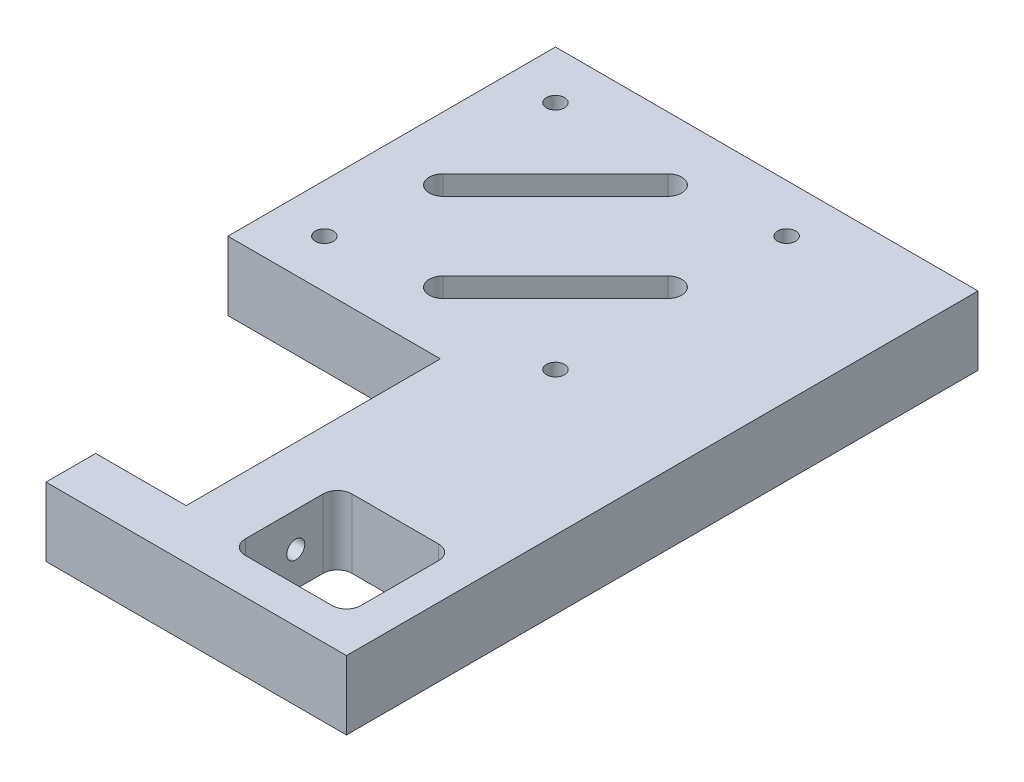
ISO-10303-21;
HEADER;
FILE_DESCRIPTION(('STEP AP214'),'2;1');
FILE_NAME('part.step','',(''),(''),'','','');
FILE_SCHEMA(('AUTOMOTIVE_DESIGN { 1 0 10303 214 1 1 1 1 }'));
ENDSEC;
DATA;
#1=APPLICATION_CONTEXT('core data for automotive mechanical design processes');
#2=APPLICATION_PROTOCOL_DEFINITION('international standard','automotive_design',2000,#1);
#3=PRODUCT_CONTEXT('',#1,'mechanical');
#4=PRODUCT('Part','Part','',(#3));
#5=PRODUCT_RELATED_PRODUCT_CATEGORY('part','',(#4));
#6=PRODUCT_DEFINITION_FORMATION('','',#4);
#7=PRODUCT_DEFINITION_CONTEXT('part definition',#1,'design');
#8=PRODUCT_DEFINITION('design','',#6,#7);
#9=PRODUCT_DEFINITION_SHAPE('','',#8);
#10=(LENGTH_UNIT() NAMED_UNIT(*) SI_UNIT(.MILLI.,.METRE.));
#11=(NAMED_UNIT(*) PLANE_ANGLE_UNIT() SI_UNIT($,.RADIAN.));
#12=(NAMED_UNIT(*) SI_UNIT($,.STERADIAN.) SOLID_ANGLE_UNIT());
#13=UNCERTAINTY_MEASURE_WITH_UNIT(LENGTH_MEASURE(1.E-05),#10,'distance_accuracy_value','');
#14=(GEOMETRIC_REPRESENTATION_CONTEXT(3) GLOBAL_UNCERTAINTY_ASSIGNED_CONTEXT((#13)) GLOBAL_UNIT_ASSIGNED_CONTEXT((#10,
#11,#12)) REPRESENTATION_CONTEXT('',''));
#15=CARTESIAN_POINT('',(0.,0.,0.));
#16=DIRECTION('',(0.,0.,1.));
#17=DIRECTION('',(1.,0.,0.));
#18=AXIS2_PLACEMENT_3D('',#15,#16,#17);
#19=CARTESIAN_POINT('',(-173.343650813896,-6.60696902421635,173.343650813896));
#20=DIRECTION('',(0.,1.,0.));
#21=DIRECTION('',(0.,0.,1.));
#22=AXIS2_PLACEMENT_3D('',#19,#20,#21);
#23=PLANE('',#22);
#24=CARTESIAN_POINT('',(-165.121825406948,-6.60696902421635,165.121825406948));
#25=DIRECTION('',(0.,1.,0.));
#26=DIRECTION('',(0.,0.,1.));
#27=AXIS2_PLACEMENT_3D('',#24,#25,#26);
#28=CIRCLE('',#27,1.24999999999997);
#29=CARTESIAN_POINT('',(-165.121825406948,-6.60696902421635,166.371825406948));
#30=VERTEX_POINT('',#29);
#31=EDGE_CURVE('E993',#30,#30,#28,.T.);
#32=ORIENTED_EDGE('',*,*,#31,.F.);
#33=EDGE_LOOP('',(#32));
#34=FACE_BOUND('',#33,.T.);
#35=CARTESIAN_POINT('',(-197.121825406948,-6.60696902421635,197.121825406948));
#36=DIRECTION('',(0.,1.,0.));
#37=DIRECTION('',(0.,0.,1.));
#38=AXIS2_PLACEMENT_3D('',#35,#36,#37);
#39=CIRCLE('',#38,1.25);
#40=CARTESIAN_POINT('',(-197.121825406948,-6.60696902421635,198.371825406948));
#41=VERTEX_POINT('',#40);
#42=EDGE_CURVE('E989',#41,#41,#39,.T.);
#43=ORIENTED_EDGE('',*,*,#42,.F.);
#44=EDGE_LOOP('',(#43));
#45=FACE_BOUND('',#44,.T.);
#46=CARTESIAN_POINT('',(-197.121825406948,-6.60696902421635,165.121825406948));
#47=DIRECTION('',(0.,1.,0.));
#48=DIRECTION('',(0.,0.,1.));
#49=AXIS2_PLACEMENT_3D('',#46,#47,#48);
#50=CIRCLE('',#49,1.25);
#51=CARTESIAN_POINT('',(-197.121825406948,-6.60696902421635,166.371825406948));
#52=VERTEX_POINT('',#51);
#53=EDGE_CURVE('E985',#52,#52,#50,.T.);
#54=ORIENTED_EDGE('',*,*,#53,.F.);
#55=EDGE_LOOP('',(#54));
#56=FACE_BOUND('',#55,.T.);
#57=CARTESIAN_POINT('',(-165.121825406948,-6.60696902421635,197.121825406948));
#58=DIRECTION('',(0.,1.,0.));
#59=DIRECTION('',(0.,0.,1.));
#60=AXIS2_PLACEMENT_3D('',#57,#58,#59);
#61=CIRCLE('',#60,1.24999999999997);
#62=CARTESIAN_POINT('',(-165.121825406948,-6.60696902421635,198.371825406948));
#63=VERTEX_POINT('',#62);
#64=EDGE_CURVE('E958',#63,#63,#61,.T.);
#65=ORIENTED_EDGE('',*,*,#64,.F.);
#66=EDGE_LOOP('',(#65));
#67=FACE_BOUND('',#66,.T.);
#68=CARTESIAN_POINT('',(-179.467375170854,-6.60696902421635,167.219926456938));
#69=DIRECTION('',(0.,1.,0.));
#70=DIRECTION('',(0.,0.,1.));
#71=AXIS2_PLACEMENT_3D('',#68,#69,#70);
#72=CIRCLE('',#71,1.91511110779744);
#73=CARTESIAN_POINT('',(-178.113187119805,-6.60696902421635,168.574114507987));
#74=VERTEX_POINT('',#73);
#75=CARTESIAN_POINT('',(-180.821563221903,-6.60696902421635,165.865738405889));
#76=VERTEX_POINT('',#75);
#77=EDGE_CURVE('E228',#74,#76,#72,.T.);
#78=ORIENTED_EDGE('',*,*,#77,.F.);
#79=DIRECTION('',(-0.707106781186548,0.,0.707106781186547));
#80=VECTOR('',#79,1.);
#81=CARTESIAN_POINT('',(-178.113187119805,-6.60696902421635,168.574114507987));
#82=LINE('',#81,#80);
#83=CARTESIAN_POINT('',(-193.669536305909,-6.60696902421635,184.130463694091));
#84=VERTEX_POINT('',#83);
#85=EDGE_CURVE('E243',#74,#84,#82,.T.);
#86=ORIENTED_EDGE('',*,*,#85,.T.);
#87=CARTESIAN_POINT('',(-195.023724356958,-6.60696902421635,182.776275643042));
#88=DIRECTION('',(0.,1.,0.));
#89=DIRECTION('',(0.,0.,1.));
#90=AXIS2_PLACEMENT_3D('',#87,#88,#89);
#91=CIRCLE('',#90,1.91511110779749);
#92=CARTESIAN_POINT('',(-196.377912408007,-6.60696902421636,181.422087591993));
#93=VERTEX_POINT('',#92);
#94=EDGE_CURVE('E968',#93,#84,#91,.T.);
#95=ORIENTED_EDGE('',*,*,#94,.F.);
#96=DIRECTION('',(-0.707106781186548,0.,0.707106781186547));
#97=VECTOR('',#96,1.);
#98=CARTESIAN_POINT('',(-180.821563221903,-6.60696902421635,165.865738405889));
#99=LINE('',#98,#97);
#100=EDGE_CURVE('E266',#76,#93,#99,.T.);
#101=ORIENTED_EDGE('',*,*,#100,.F.);
#102=EDGE_LOOP('',(#78,#86,#95,#101));
#103=FACE_BOUND('',#102,.T.);
#104=CARTESIAN_POINT('',(-167.219926456938,-6.60696902421635,179.467375170854));
#105=DIRECTION('',(0.,1.,0.));
#106=DIRECTION('',(0.,0.,1.));
#107=AXIS2_PLACEMENT_3D('',#104,#105,#106);
#108=CIRCLE('',#107,1.91511110779749);
#109=CARTESIAN_POINT('',(-165.865738405889,-6.60696902421635,180.821563221903));
#110=VERTEX_POINT('',#109);
#111=CARTESIAN_POINT('',(-168.574114507987,-6.60696902421635,178.113187119805));
#112=VERTEX_POINT('',#111);
#113=EDGE_CURVE('E209',#110,#112,#108,.T.);
#114=ORIENTED_EDGE('',*,*,#113,.F.);
#115=DIRECTION('',(-0.707106781186548,0.,0.707106781186547));
#116=VECTOR('',#115,1.);
#117=CARTESIAN_POINT('',(-165.865738405889,-6.60696902421635,180.821563221903));
#118=LINE('',#117,#116);
#119=CARTESIAN_POINT('',(-181.422087591993,-6.60696902421635,196.377912408007));
#120=VERTEX_POINT('',#119);
#121=EDGE_CURVE('E218',#110,#120,#118,.T.);
#122=ORIENTED_EDGE('',*,*,#121,.T.);
#123=CARTESIAN_POINT('',(-182.776275643042,-6.60696902421635,195.023724356958));
#124=DIRECTION('',(0.,1.,0.));
#125=DIRECTION('',(0.,0.,1.));
#126=AXIS2_PLACEMENT_3D('',#123,#124,#125);
#127=CIRCLE('',#126,1.91511110779749);
#128=CARTESIAN_POINT('',(-184.130463694091,-6.60696902421635,193.669536305909));
#129=VERTEX_POINT('',#128);
#130=EDGE_CURVE('E961',#129,#120,#127,.T.);
#131=ORIENTED_EDGE('',*,*,#130,.F.);
#132=DIRECTION('',(-0.707106781186548,0.,0.707106781186547));
#133=VECTOR('',#132,1.);
#134=CARTESIAN_POINT('',(-168.574114507987,-6.60696902421635,178.113187119805));
#135=LINE('',#134,#133);
#136=EDGE_CURVE('E227',#112,#129,#135,.T.);
#137=ORIENTED_EDGE('',*,*,#136,.F.);
#138=EDGE_LOOP('',(#114,#122,#131,#137));
#139=FACE_BOUND('',#138,.T.);
#140=DIRECTION('',(0.,0.,1.));
#141=VECTOR('',#140,1.);
#142=CARTESIAN_POINT('',(-145.3,-6.60696902421639,0.));
#143=LINE('',#142,#141);
#144=CARTESIAN_POINT('',(-145.3,-6.60696902421635,158.443650813896));
#145=VERTEX_POINT('',#144);
#146=CARTESIAN_POINT('',(-145.3,-6.60696902421633,245.88));
#147=VERTEX_POINT('',#146);
#148=EDGE_CURVE('E353',#145,#147,#143,.T.);
#149=ORIENTED_EDGE('',*,*,#148,.F.);
#150=DIRECTION('',(-1.,0.,0.));
#151=VECTOR('',#150,1.);
#152=CARTESIAN_POINT('',(0.,-6.60696902421632,158.443650813896));
#153=LINE('',#152,#151);
#154=CARTESIAN_POINT('',(-203.8,-6.60696902421636,158.443650813896));
#155=VERTEX_POINT('',#154);
#156=EDGE_CURVE('E389',#145,#155,#153,.T.);
#157=ORIENTED_EDGE('',*,*,#156,.T.);
#158=DIRECTION('',(0.,0.,-1.));
#159=VECTOR('',#158,1.);
#160=CARTESIAN_POINT('',(-203.8,-6.60696902421639,1.26042652657078E-13));
#161=LINE('',#160,#159);
#162=CARTESIAN_POINT('',(-203.8,-6.60696902421635,203.8));
#163=VERTEX_POINT('',#162);
#164=EDGE_CURVE('E398',#163,#155,#161,.T.);
#165=ORIENTED_EDGE('',*,*,#164,.F.);
#166=DIRECTION('',(-1.,0.,0.));
#167=VECTOR('',#166,1.);
#168=CARTESIAN_POINT('',(0.,-6.6069690242163,203.8));
#169=LINE('',#168,#167);
#170=CARTESIAN_POINT('',(-174.375,-6.60696902421635,203.8));
#171=VERTEX_POINT('',#170);
#172=EDGE_CURVE('E342',#171,#163,#169,.T.);
#173=ORIENTED_EDGE('',*,*,#172,.F.);
#174=DIRECTION('',(0.,0.,-1.));
#175=VECTOR('',#174,1.);
#176=CARTESIAN_POINT('',(-174.375,-6.60696902421634,239.));
#177=LINE('',#176,#175);
#178=CARTESIAN_POINT('',(-174.375,-6.60696902421634,239.));
#179=VERTEX_POINT('',#178);
#180=EDGE_CURVE('E377',#179,#171,#177,.T.);
#181=ORIENTED_EDGE('',*,*,#180,.F.);
#182=DIRECTION('',(1.,0.,0.));
#183=VECTOR('',#182,1.);
#184=CARTESIAN_POINT('',(2.21279938186207E-12,-6.60696902421629,238.999999999998));
#185=LINE('',#184,#183);
#186=CARTESIAN_POINT('',(-186.9,-6.60696902421634,239.));
#187=VERTEX_POINT('',#186);
#188=EDGE_CURVE('E344',#187,#179,#185,.T.);
#189=ORIENTED_EDGE('',*,*,#188,.F.);
#190=DIRECTION('',(0.,0.,1.));
#191=VECTOR('',#190,1.);
#192=CARTESIAN_POINT('',(-186.899999999999,-6.6069690242164,-7.52394384803343E-13));
#193=LINE('',#192,#191);
#194=CARTESIAN_POINT('',(-186.9,-6.60696902421634,245.88));
#195=VERTEX_POINT('',#194);
#196=EDGE_CURVE('E347',#187,#195,#193,.T.);
#197=ORIENTED_EDGE('',*,*,#196,.T.);
#198=DIRECTION('',(1.,0.,0.));
#199=VECTOR('',#198,1.);
#200=CARTESIAN_POINT('',(0.,-6.60696902421629,245.88));
#201=LINE('',#200,#199);
#202=EDGE_CURVE('E350',#195,#147,#201,.T.);
#203=ORIENTED_EDGE('',*,*,#202,.T.);
#204=EDGE_LOOP('',(#149,#157,#165,#173,#181,#189,#197,#203));
#205=FACE_BOUND('',#204,.T.);
#206=DIRECTION('',(0.,0.,-1.));
#207=VECTOR('',#206,1.);
#208=CARTESIAN_POINT('',(-150.3,-6.60696902421639,0.));
#209=LINE('',#208,#207);
#210=CARTESIAN_POINT('',(-150.3,-6.60696902421633,238.88));
#211=VERTEX_POINT('',#210);
#212=CARTESIAN_POINT('',(-150.3,-6.60696902421633,228.12));
#213=VERTEX_POINT('',#212);
#214=EDGE_CURVE('E356',#211,#213,#209,.T.);
#215=ORIENTED_EDGE('',*,*,#214,.F.);
#216=CARTESIAN_POINT('',(-152.3,-6.60696902421636,238.88));
#217=DIRECTION('',(0.,1.,0.));
#218=DIRECTION('',(0.,0.,1.));
#219=AXIS2_PLACEMENT_3D('',#216,#217,#218);
#220=CIRCLE('',#219,2.);
#221=CARTESIAN_POINT('',(-152.3,-6.60696902421633,240.88));
#222=VERTEX_POINT('',#221);
#223=EDGE_CURVE('E294',#211,#222,#220,.F.);
#224=ORIENTED_EDGE('',*,*,#223,.T.);
#225=DIRECTION('',(1.,0.,0.));
#226=VECTOR('',#225,1.);
#227=CARTESIAN_POINT('',(0.,-6.60696902421629,240.88));
#228=LINE('',#227,#226);
#229=CARTESIAN_POINT('',(-164.3,-6.60696902421633,240.88));
#230=VERTEX_POINT('',#229);
#231=EDGE_CURVE('E359',#230,#222,#228,.T.);
#232=ORIENTED_EDGE('',*,*,#231,.F.);
#233=CARTESIAN_POINT('',(-164.3,-6.60696902421636,238.88));
#234=DIRECTION('',(0.,1.,0.));
#235=DIRECTION('',(0.,0.,1.));
#236=AXIS2_PLACEMENT_3D('',#233,#234,#235);
#237=CIRCLE('',#236,2.);
#238=CARTESIAN_POINT('',(-166.3,-6.60696902421633,238.88));
#239=VERTEX_POINT('',#238);
#240=EDGE_CURVE('E55',#230,#239,#237,.F.);
#241=ORIENTED_EDGE('',*,*,#240,.T.);
#242=DIRECTION('',(0.,0.,1.));
#243=VECTOR('',#242,1.);
#244=CARTESIAN_POINT('',(-166.3,-6.60696902421639,0.));
#245=LINE('',#244,#243);
#246=CARTESIAN_POINT('',(-166.3,-6.60696902421634,228.12));
#247=VERTEX_POINT('',#246);
#248=EDGE_CURVE('E304',#247,#239,#245,.T.);
#249=ORIENTED_EDGE('',*,*,#248,.F.);
#250=CARTESIAN_POINT('',(-164.3,-6.60696902421636,228.12));
#251=DIRECTION('',(0.,1.,0.));
#252=DIRECTION('',(0.,0.,1.));
#253=AXIS2_PLACEMENT_3D('',#250,#251,#252);
#254=CIRCLE('',#253,2.);
#255=CARTESIAN_POINT('',(-164.3,-6.60696902421634,226.12));
#256=VERTEX_POINT('',#255);
#257=EDGE_CURVE('E48',#247,#256,#254,.F.);
#258=ORIENTED_EDGE('',*,*,#257,.T.);
#259=DIRECTION('',(-1.,0.,0.));
#260=VECTOR('',#259,1.);
#261=CARTESIAN_POINT('',(0.,-6.6069690242163,226.12));
#262=LINE('',#261,#260);
#263=CARTESIAN_POINT('',(-152.3,-6.60696902421633,226.12));
#264=VERTEX_POINT('',#263);
#265=EDGE_CURVE('E303',#264,#256,#262,.T.);
#266=ORIENTED_EDGE('',*,*,#265,.F.);
#267=CARTESIAN_POINT('',(-152.3,-6.60696902421636,228.12));
#268=DIRECTION('',(0.,1.,0.));
#269=DIRECTION('',(0.,0.,1.));
#270=AXIS2_PLACEMENT_3D('',#267,#268,#269);
#271=CIRCLE('',#270,2.);
#272=EDGE_CURVE('E290',#264,#213,#271,.F.);
#273=ORIENTED_EDGE('',*,*,#272,.T.);
#274=EDGE_LOOP('',(#215,#224,#232,#241,#249,#258,#266,#273));
#275=FACE_BOUND('',#274,.T.);
#276=ADVANCED_FACE('F40',(#34,#45,#56,#67,#103,#139,#205,#275),#23,.T.);
#277=CARTESIAN_POINT('',(-180.821563221903,0.,165.865738405889));
#278=DIRECTION('',(-0.707106781186547,0.,-0.707106781186548));
#279=DIRECTION('',(-0.707106781186548,0.,0.707106781186547));
#280=AXIS2_PLACEMENT_3D('',#277,#278,#279);
#281=PLANE('',#280);
#282=DIRECTION('',(0.,-1.,0.));
#283=VECTOR('',#282,1.);
#284=CARTESIAN_POINT('',(-196.377912408007,0.,181.422087591993));
#285=LINE('',#284,#283);
#286=CARTESIAN_POINT('',(-196.377912408007,-16.1319690242164,181.422087591993));
#287=VERTEX_POINT('',#286);
#288=EDGE_CURVE('E257',#93,#287,#285,.T.);
#289=ORIENTED_EDGE('',*,*,#288,.T.);
#290=DIRECTION('',(-0.707106781186548,0.,0.707106781186547));
#291=VECTOR('',#290,1.);
#292=CARTESIAN_POINT('',(-180.821563221903,-16.1319690242164,165.865738405889));
#293=LINE('',#292,#291);
#294=CARTESIAN_POINT('',(-180.821563221903,-16.1319690242164,165.865738405889));
#295=VERTEX_POINT('',#294);
#296=EDGE_CURVE('E263',#295,#287,#293,.T.);
#297=ORIENTED_EDGE('',*,*,#296,.F.);
#298=DIRECTION('',(0.,-1.,0.));
#299=VECTOR('',#298,1.);
#300=CARTESIAN_POINT('',(-180.821563221903,0.,165.865738405889));
#301=LINE('',#300,#299);
#302=EDGE_CURVE('E261',#76,#295,#301,.T.);
#303=ORIENTED_EDGE('',*,*,#302,.F.);
#304=ORIENTED_EDGE('',*,*,#100,.T.);
#305=EDGE_LOOP('',(#289,#297,#303,#304));
#306=FACE_BOUND('',#305,.T.);
#307=ADVANCED_FACE('F464',(#306),#281,.F.);
#308=CARTESIAN_POINT('',(-173.343650813896,-16.1319690242164,173.343650813896));
#309=DIRECTION('',(0.,1.,0.));
#310=DIRECTION('',(0.,0.,1.));
#311=AXIS2_PLACEMENT_3D('',#308,#309,#310);
#312=PLANE('',#311);
#313=CARTESIAN_POINT('',(-165.121825406948,-16.1319690242164,165.121825406948));
#314=DIRECTION('',(0.,1.,0.));
#315=DIRECTION('',(0.,0.,1.));
#316=AXIS2_PLACEMENT_3D('',#313,#314,#315);
#317=CIRCLE('',#316,1.24999999999999);
#318=CARTESIAN_POINT('',(-165.121825406948,-16.1319690242164,166.371825406948));
#319=VERTEX_POINT('',#318);
#320=EDGE_CURVE('E945',#319,#319,#317,.T.);
#321=ORIENTED_EDGE('',*,*,#320,.T.);
#322=EDGE_LOOP('',(#321));
#323=FACE_BOUND('',#322,.T.);
#324=CARTESIAN_POINT('',(-197.121825406948,-16.1319690242164,197.121825406948));
#325=DIRECTION('',(0.,1.,0.));
#326=DIRECTION('',(0.,0.,1.));
#327=AXIS2_PLACEMENT_3D('',#324,#325,#326);
#328=CIRCLE('',#327,1.25);
#329=CARTESIAN_POINT('',(-197.121825406948,-16.1319690242164,198.371825406948));
#330=VERTEX_POINT('',#329);
#331=EDGE_CURVE('E949',#330,#330,#328,.T.);
#332=ORIENTED_EDGE('',*,*,#331,.T.);
#333=EDGE_LOOP('',(#332));
#334=FACE_BOUND('',#333,.T.);
#335=CARTESIAN_POINT('',(-197.121825406948,-16.1319690242164,165.121825406948));
#336=DIRECTION('',(0.,1.,0.));
#337=DIRECTION('',(0.,0.,1.));
#338=AXIS2_PLACEMENT_3D('',#335,#336,#337);
#339=CIRCLE('',#338,1.25);
#340=CARTESIAN_POINT('',(-197.121825406948,-16.1319690242164,166.371825406948));
#341=VERTEX_POINT('',#340);
#342=EDGE_CURVE('E953',#341,#341,#339,.T.);
#343=ORIENTED_EDGE('',*,*,#342,.T.);
#344=EDGE_LOOP('',(#343));
#345=FACE_BOUND('',#344,.T.);
#346=CARTESIAN_POINT('',(-165.121825406948,-16.1319690242164,197.121825406948));
#347=DIRECTION('',(0.,1.,0.));
#348=DIRECTION('',(0.,0.,1.));
#349=AXIS2_PLACEMENT_3D('',#346,#347,#348);
#350=CIRCLE('',#349,1.24999999999999);
#351=CARTESIAN_POINT('',(-165.121825406948,-16.1319690242164,198.371825406948));
#352=VERTEX_POINT('',#351);
#353=EDGE_CURVE('E956',#352,#352,#350,.T.);
#354=ORIENTED_EDGE('',*,*,#353,.T.);
#355=EDGE_LOOP('',(#354));
#356=FACE_BOUND('',#355,.T.);
#357=DIRECTION('',(0.,0.,1.));
#358=VECTOR('',#357,1.);
#359=CARTESIAN_POINT('',(-174.375,-16.1319690242164,239.));
#360=LINE('',#359,#358);
#361=CARTESIAN_POINT('',(-174.375,-16.1319690242164,203.8));
#362=VERTEX_POINT('',#361);
#363=CARTESIAN_POINT('',(-174.375,-16.1319690242164,239.));
#364=VERTEX_POINT('',#363);
#365=EDGE_CURVE('E345',#362,#364,#360,.T.);
#366=ORIENTED_EDGE('',*,*,#365,.F.);
#367=DIRECTION('',(1.,0.,0.));
#368=VECTOR('',#367,1.);
#369=CARTESIAN_POINT('',(0.,-16.1319690242164,203.8));
#370=LINE('',#369,#368);
#371=CARTESIAN_POINT('',(-203.8,-16.1319690242163,203.8));
#372=VERTEX_POINT('',#371);
#373=EDGE_CURVE('E323',#372,#362,#370,.T.);
#374=ORIENTED_EDGE('',*,*,#373,.F.);
#375=DIRECTION('',(0.,0.,1.));
#376=VECTOR('',#375,1.);
#377=CARTESIAN_POINT('',(-203.8,-16.1319690242163,1.4312319303861E-13));
#378=LINE('',#377,#376);
#379=CARTESIAN_POINT('',(-203.8,-16.1319690242163,158.443650813896));
#380=VERTEX_POINT('',#379);
#381=EDGE_CURVE('E409',#380,#372,#378,.T.);
#382=ORIENTED_EDGE('',*,*,#381,.F.);
#383=DIRECTION('',(1.,0.,0.));
#384=VECTOR('',#383,1.);
#385=CARTESIAN_POINT('',(0.,-16.1319690242163,158.443650813896));
#386=LINE('',#385,#384);
#387=CARTESIAN_POINT('',(-145.3,-16.1319690242163,158.443650813896));
#388=VERTEX_POINT('',#387);
#389=EDGE_CURVE('E416',#380,#388,#386,.T.);
#390=ORIENTED_EDGE('',*,*,#389,.T.);
#391=DIRECTION('',(0.,0.,-1.));
#392=VECTOR('',#391,1.);
#393=CARTESIAN_POINT('',(-145.3,-16.1319690242164,0.));
#394=LINE('',#393,#392);
#395=CARTESIAN_POINT('',(-145.3,-16.1319690242163,245.88));
#396=VERTEX_POINT('',#395);
#397=EDGE_CURVE('E233',#396,#388,#394,.T.);
#398=ORIENTED_EDGE('',*,*,#397,.F.);
#399=DIRECTION('',(-1.,0.,0.));
#400=VECTOR('',#399,1.);
#401=CARTESIAN_POINT('',(0.,-16.1319690242163,245.88));
#402=LINE('',#401,#400);
#403=CARTESIAN_POINT('',(-186.9,-16.1319690242163,245.88));
#404=VERTEX_POINT('',#403);
#405=EDGE_CURVE('E339',#396,#404,#402,.T.);
#406=ORIENTED_EDGE('',*,*,#405,.T.);
#407=DIRECTION('',(0.,0.,-1.));
#408=VECTOR('',#407,1.);
#409=CARTESIAN_POINT('',(-186.899999999999,-16.1319690242163,-7.25329968191403E-13));
#410=LINE('',#409,#408);
#411=CARTESIAN_POINT('',(-186.9,-16.1319690242164,239.));
#412=VERTEX_POINT('',#411);
#413=EDGE_CURVE('E337',#404,#412,#410,.T.);
#414=ORIENTED_EDGE('',*,*,#413,.T.);
#415=DIRECTION('',(-1.,0.,0.));
#416=VECTOR('',#415,1.);
#417=CARTESIAN_POINT('',(2.23986379847401E-12,-16.1319690242164,238.999999999998));
#418=LINE('',#417,#416);
#419=EDGE_CURVE('E333',#364,#412,#418,.T.);
#420=ORIENTED_EDGE('',*,*,#419,.F.);
#421=EDGE_LOOP('',(#366,#374,#382,#390,#398,#406,#414,#420));
#422=FACE_BOUND('',#421,.T.);
#423=DIRECTION('',(-0.707106781186548,0.,0.707106781186547));
#424=VECTOR('',#423,1.);
#425=CARTESIAN_POINT('',(-165.865738405889,-16.1319690242163,180.821563221903));
#426=LINE('',#425,#424);
#427=CARTESIAN_POINT('',(-165.865738405889,-16.1319690242164,180.821563221903));
#428=VERTEX_POINT('',#427);
#429=CARTESIAN_POINT('',(-181.422087591993,-16.1319690242164,196.377912408007));
#430=VERTEX_POINT('',#429);
#431=EDGE_CURVE('E231',#428,#430,#426,.T.);
#432=ORIENTED_EDGE('',*,*,#431,.F.);
#433=CARTESIAN_POINT('',(-167.219926456938,-16.1319690242164,179.467375170854));
#434=DIRECTION('',(0.,1.,0.));
#435=DIRECTION('',(0.,0.,1.));
#436=AXIS2_PLACEMENT_3D('',#433,#434,#435);
#437=CIRCLE('',#436,1.91511110779749);
#438=CARTESIAN_POINT('',(-168.574114507987,-16.1319690242164,178.113187119805));
#439=VERTEX_POINT('',#438);
#440=EDGE_CURVE('E212',#428,#439,#437,.T.);
#441=ORIENTED_EDGE('',*,*,#440,.T.);
#442=DIRECTION('',(-0.707106781186548,0.,0.707106781186547));
#443=VECTOR('',#442,1.);
#444=CARTESIAN_POINT('',(-168.574114507987,-16.1319690242164,178.113187119805));
#445=LINE('',#444,#443);
#446=CARTESIAN_POINT('',(-184.130463694091,-16.1319690242164,193.669536305909));
#447=VERTEX_POINT('',#446);
#448=EDGE_CURVE('E239',#439,#447,#445,.T.);
#449=ORIENTED_EDGE('',*,*,#448,.T.);
#450=CARTESIAN_POINT('',(-182.776275643042,-16.1319690242164,195.023724356958));
#451=DIRECTION('',(0.,1.,0.));
#452=DIRECTION('',(0.,0.,1.));
#453=AXIS2_PLACEMENT_3D('',#450,#451,#452);
#454=CIRCLE('',#453,1.91511110779749);
#455=EDGE_CURVE('E957',#447,#430,#454,.T.);
#456=ORIENTED_EDGE('',*,*,#455,.T.);
#457=EDGE_LOOP('',(#432,#441,#449,#456));
#458=FACE_BOUND('',#457,.T.);
#459=DIRECTION('',(-0.707106781186548,0.,0.707106781186547));
#460=VECTOR('',#459,1.);
#461=CARTESIAN_POINT('',(-178.113187119805,-16.1319690242164,168.574114507987));
#462=LINE('',#461,#460);
#463=CARTESIAN_POINT('',(-178.113187119805,-16.1319690242164,168.574114507987));
#464=VERTEX_POINT('',#463);
#465=CARTESIAN_POINT('',(-193.669536305909,-16.1319690242164,184.130463694091));
#466=VERTEX_POINT('',#465);
#467=EDGE_CURVE('E246',#464,#466,#462,.T.);
#468=ORIENTED_EDGE('',*,*,#467,.F.);
#469=CARTESIAN_POINT('',(-179.467375170854,-16.1319690242164,167.219926456938));
#470=DIRECTION('',(0.,1.,0.));
#471=DIRECTION('',(0.,0.,1.));
#472=AXIS2_PLACEMENT_3D('',#469,#470,#471);
#473=CIRCLE('',#472,1.91511110779744);
#474=EDGE_CURVE('E403',#464,#295,#473,.T.);
#475=ORIENTED_EDGE('',*,*,#474,.T.);
#476=ORIENTED_EDGE('',*,*,#296,.T.);
#477=CARTESIAN_POINT('',(-195.023724356958,-16.1319690242164,182.776275643042));
#478=DIRECTION('',(0.,1.,0.));
#479=DIRECTION('',(0.,0.,1.));
#480=AXIS2_PLACEMENT_3D('',#477,#478,#479);
#481=CIRCLE('',#480,1.91511110779749);
#482=EDGE_CURVE('E970',#287,#466,#481,.T.);
#483=ORIENTED_EDGE('',*,*,#482,.T.);
#484=EDGE_LOOP('',(#468,#475,#476,#483));
#485=FACE_BOUND('',#484,.T.);
#486=DIRECTION('',(1.,0.,0.));
#487=VECTOR('',#486,1.);
#488=CARTESIAN_POINT('',(0.,-16.1319690242164,226.12));
#489=LINE('',#488,#487);
#490=CARTESIAN_POINT('',(-164.3,-16.1319690242164,226.12));
#491=VERTEX_POINT('',#490);
#492=CARTESIAN_POINT('',(-152.3,-16.1319690242164,226.12));
#493=VERTEX_POINT('',#492);
#494=EDGE_CURVE('E319',#491,#493,#489,.T.);
#495=ORIENTED_EDGE('',*,*,#494,.F.);
#496=CARTESIAN_POINT('',(-164.3,-16.1319690242163,228.12));
#497=DIRECTION('',(0.,1.,0.));
#498=DIRECTION('',(0.,0.,1.));
#499=AXIS2_PLACEMENT_3D('',#496,#497,#498);
#500=CIRCLE('',#499,2.);
#501=CARTESIAN_POINT('',(-166.3,-16.1319690242163,228.12));
#502=VERTEX_POINT('',#501);
#503=EDGE_CURVE('E11',#491,#502,#500,.T.);
#504=ORIENTED_EDGE('',*,*,#503,.T.);
#505=DIRECTION('',(0.,0.,-1.));
#506=VECTOR('',#505,1.);
#507=CARTESIAN_POINT('',(-166.3,-16.1319690242163,0.));
#508=LINE('',#507,#506);
#509=CARTESIAN_POINT('',(-166.3,-16.1319690242163,238.88));
#510=VERTEX_POINT('',#509);
#511=EDGE_CURVE('E317',#510,#502,#508,.T.);
#512=ORIENTED_EDGE('',*,*,#511,.F.);
#513=CARTESIAN_POINT('',(-164.3,-16.1319690242163,238.88));
#514=DIRECTION('',(0.,1.,0.));
#515=DIRECTION('',(0.,0.,1.));
#516=AXIS2_PLACEMENT_3D('',#513,#514,#515);
#517=CIRCLE('',#516,2.);
#518=CARTESIAN_POINT('',(-164.3,-16.1319690242164,240.88));
#519=VERTEX_POINT('',#518);
#520=EDGE_CURVE('E299',#510,#519,#517,.T.);
#521=ORIENTED_EDGE('',*,*,#520,.T.);
#522=DIRECTION('',(-1.,0.,0.));
#523=VECTOR('',#522,1.);
#524=CARTESIAN_POINT('',(0.,-16.1319690242164,240.88));
#525=LINE('',#524,#523);
#526=CARTESIAN_POINT('',(-152.3,-16.1319690242164,240.88));
#527=VERTEX_POINT('',#526);
#528=EDGE_CURVE('E236',#527,#519,#525,.T.);
#529=ORIENTED_EDGE('',*,*,#528,.F.);
#530=CARTESIAN_POINT('',(-152.3,-16.1319690242164,238.88));
#531=DIRECTION('',(0.,1.,0.));
#532=DIRECTION('',(0.,0.,1.));
#533=AXIS2_PLACEMENT_3D('',#530,#531,#532);
#534=CIRCLE('',#533,2.);
#535=CARTESIAN_POINT('',(-150.3,-16.1319690242164,238.88));
#536=VERTEX_POINT('',#535);
#537=EDGE_CURVE('E296',#527,#536,#534,.T.);
#538=ORIENTED_EDGE('',*,*,#537,.T.);
#539=DIRECTION('',(0.,0.,1.));
#540=VECTOR('',#539,1.);
#541=CARTESIAN_POINT('',(-150.3,-16.1319690242164,0.));
#542=LINE('',#541,#540);
#543=CARTESIAN_POINT('',(-150.3,-16.1319690242164,228.12));
#544=VERTEX_POINT('',#543);
#545=EDGE_CURVE('E325',#544,#536,#542,.T.);
#546=ORIENTED_EDGE('',*,*,#545,.F.);
#547=CARTESIAN_POINT('',(-152.3,-16.1319690242163,228.12));
#548=DIRECTION('',(0.,1.,0.));
#549=DIRECTION('',(0.,0.,1.));
#550=AXIS2_PLACEMENT_3D('',#547,#548,#549);
#551=CIRCLE('',#550,2.);
#552=EDGE_CURVE('E292',#544,#493,#551,.T.);
#553=ORIENTED_EDGE('',*,*,#552,.T.);
#554=EDGE_LOOP('',(#495,#504,#512,#521,#529,#538,#546,#553));
#555=FACE_BOUND('',#554,.T.);
#556=ADVANCED_FACE('F316',(#323,#334,#345,#356,#422,#458,#485,#555),#312,.F.);
#557=CARTESIAN_POINT('',(-168.574114507987,0.,178.113187119805));
#558=DIRECTION('',(-0.707106781186547,0.,-0.707106781186548));
#559=DIRECTION('',(-0.707106781186548,0.,0.707106781186547));
#560=AXIS2_PLACEMENT_3D('',#557,#558,#559);
#561=PLANE('',#560);
#562=DIRECTION('',(0.,-1.,0.));
#563=VECTOR('',#562,1.);
#564=CARTESIAN_POINT('',(-184.130463694091,0.,193.669536305909));
#565=LINE('',#564,#563);
#566=EDGE_CURVE('E253',#129,#447,#565,.T.);
#567=ORIENTED_EDGE('',*,*,#566,.T.);
#568=ORIENTED_EDGE('',*,*,#448,.F.);
#569=DIRECTION('',(0.,-1.,0.));
#570=VECTOR('',#569,1.);
#571=CARTESIAN_POINT('',(-168.574114507987,0.,178.113187119805));
#572=LINE('',#571,#570);
#573=EDGE_CURVE('E254',#112,#439,#572,.T.);
#574=ORIENTED_EDGE('',*,*,#573,.F.);
#575=ORIENTED_EDGE('',*,*,#136,.T.);
#576=EDGE_LOOP('',(#567,#568,#574,#575));
#577=FACE_BOUND('',#576,.T.);
#578=ADVANCED_FACE('F785',(#577),#561,.F.);
#579=CARTESIAN_POINT('',(-178.113187119805,0.,168.574114507987));
#580=DIRECTION('',(-0.707106781186547,0.,-0.707106781186548));
#581=DIRECTION('',(-0.707106781186548,0.,0.707106781186547));
#582=AXIS2_PLACEMENT_3D('',#579,#580,#581);
#583=PLANE('',#582);
#584=DIRECTION('',(0.,-1.,0.));
#585=VECTOR('',#584,1.);
#586=CARTESIAN_POINT('',(-193.669536305909,0.,184.130463694091));
#587=LINE('',#586,#585);
#588=EDGE_CURVE('E251',#84,#466,#587,.T.);
#589=ORIENTED_EDGE('',*,*,#588,.F.);
#590=ORIENTED_EDGE('',*,*,#85,.F.);
#591=DIRECTION('',(0.,-1.,0.));
#592=VECTOR('',#591,1.);
#593=CARTESIAN_POINT('',(-178.113187119805,0.,168.574114507987));
#594=LINE('',#593,#592);
#595=EDGE_CURVE('E242',#74,#464,#594,.T.);
#596=ORIENTED_EDGE('',*,*,#595,.T.);
#597=ORIENTED_EDGE('',*,*,#467,.T.);
#598=EDGE_LOOP('',(#589,#590,#596,#597));
#599=FACE_BOUND('',#598,.T.);
#600=ADVANCED_FACE('F461',(#599),#583,.T.);
#601=CARTESIAN_POINT('',(-165.865738405889,0.,180.821563221903));
#602=DIRECTION('',(-0.707106781186547,0.,-0.707106781186548));
#603=DIRECTION('',(-0.707106781186548,0.,0.707106781186547));
#604=AXIS2_PLACEMENT_3D('',#601,#602,#603);
#605=PLANE('',#604);
#606=DIRECTION('',(0.,-1.,0.));
#607=VECTOR('',#606,1.);
#608=CARTESIAN_POINT('',(-181.422087591993,0.,196.377912408007));
#609=LINE('',#608,#607);
#610=EDGE_CURVE('E217',#120,#430,#609,.T.);
#611=ORIENTED_EDGE('',*,*,#610,.F.);
#612=ORIENTED_EDGE('',*,*,#121,.F.);
#613=DIRECTION('',(0.,-1.,0.));
#614=VECTOR('',#613,1.);
#615=CARTESIAN_POINT('',(-165.865738405889,0.,180.821563221903));
#616=LINE('',#615,#614);
#617=EDGE_CURVE('E206',#110,#428,#616,.T.);
#618=ORIENTED_EDGE('',*,*,#617,.T.);
#619=ORIENTED_EDGE('',*,*,#431,.T.);
#620=EDGE_LOOP('',(#611,#612,#618,#619));
#621=FACE_BOUND('',#620,.T.);
#622=ADVANCED_FACE('F230',(#621),#605,.T.);
#623=CARTESIAN_POINT('',(0.,-116.926756472673,203.8));
#624=DIRECTION('',(0.,0.,-1.));
#625=DIRECTION('',(0.,1.,0.));
#626=AXIS2_PLACEMENT_3D('',#623,#624,#625);
#627=PLANE('',#626);
#628=ORIENTED_EDGE('',*,*,#172,.T.);
#629=DIRECTION('',(0.,1.,0.));
#630=VECTOR('',#629,1.);
#631=CARTESIAN_POINT('',(-203.8,-90.155265434818,203.8));
#632=LINE('',#631,#630);
#633=EDGE_CURVE('E412',#372,#163,#632,.T.);
#634=ORIENTED_EDGE('',*,*,#633,.F.);
#635=ORIENTED_EDGE('',*,*,#373,.T.);
#636=DIRECTION('',(0.,1.,0.));
#637=VECTOR('',#636,1.);
#638=CARTESIAN_POINT('',(-174.375,-52.5979206092223,203.8));
#639=LINE('',#638,#637);
#640=EDGE_CURVE('E438',#362,#171,#639,.T.);
#641=ORIENTED_EDGE('',*,*,#640,.T.);
#642=EDGE_LOOP('',(#628,#634,#635,#641));
#643=FACE_BOUND('',#642,.T.);
#644=ADVANCED_FACE('F451',(#643),#627,.F.);
#645=CARTESIAN_POINT('',(2.23986379847401E-12,-116.926756472673,238.999999999998));
#646=DIRECTION('',(0.,0.,1.));
#647=DIRECTION('',(1.,0.,0.));
#648=AXIS2_PLACEMENT_3D('',#645,#646,#647);
#649=PLANE('',#648);
#650=ORIENTED_EDGE('',*,*,#188,.T.);
#651=DIRECTION('',(0.,1.,0.));
#652=VECTOR('',#651,1.);
#653=CARTESIAN_POINT('',(-174.375,-52.5979206092223,239.));
#654=LINE('',#653,#652);
#655=EDGE_CURVE('E329',#364,#179,#654,.T.);
#656=ORIENTED_EDGE('',*,*,#655,.F.);
#657=ORIENTED_EDGE('',*,*,#419,.T.);
#658=DIRECTION('',(0.,1.,0.));
#659=VECTOR('',#658,1.);
#660=CARTESIAN_POINT('',(-186.9,-116.926756472673,239.));
#661=LINE('',#660,#659);
#662=EDGE_CURVE('E310',#412,#187,#661,.T.);
#663=ORIENTED_EDGE('',*,*,#662,.T.);
#664=EDGE_LOOP('',(#650,#656,#657,#663));
#665=FACE_BOUND('',#664,.T.);
#666=ADVANCED_FACE('F369',(#665),#649,.F.);
#667=CARTESIAN_POINT('',(-186.899999999999,-116.926756472673,-7.25329968191403E-13));
#668=DIRECTION('',(-1.,0.,0.));
#669=DIRECTION('',(0.,0.,1.));
#670=AXIS2_PLACEMENT_3D('',#667,#668,#669);
#671=PLANE('',#670);
#672=ORIENTED_EDGE('',*,*,#413,.F.);
#673=DIRECTION('',(0.,1.,0.));
#674=VECTOR('',#673,1.);
#675=CARTESIAN_POINT('',(-186.9,-116.926756472673,245.88));
#676=LINE('',#675,#674);
#677=EDGE_CURVE('E365',#404,#195,#676,.T.);
#678=ORIENTED_EDGE('',*,*,#677,.T.);
#679=ORIENTED_EDGE('',*,*,#196,.F.);
#680=ORIENTED_EDGE('',*,*,#662,.F.);
#681=EDGE_LOOP('',(#672,#678,#679,#680));
#682=FACE_BOUND('',#681,.T.);
#683=ADVANCED_FACE('F378',(#682),#671,.T.);
#684=CARTESIAN_POINT('',(0.,-116.926756472673,245.88));
#685=DIRECTION('',(0.,0.,1.));
#686=DIRECTION('',(0.,-1.,0.));
#687=AXIS2_PLACEMENT_3D('',#684,#685,#686);
#688=PLANE('',#687);
#689=ORIENTED_EDGE('',*,*,#405,.F.);
#690=DIRECTION('',(0.,1.,0.));
#691=VECTOR('',#690,1.);
#692=CARTESIAN_POINT('',(-145.3,-116.926756472673,245.88));
#693=LINE('',#692,#691);
#694=EDGE_CURVE('E363',#396,#147,#693,.T.);
#695=ORIENTED_EDGE('',*,*,#694,.T.);
#696=ORIENTED_EDGE('',*,*,#202,.F.);
#697=ORIENTED_EDGE('',*,*,#677,.F.);
#698=EDGE_LOOP('',(#689,#695,#696,#697));
#699=FACE_BOUND('',#698,.T.);
#700=ADVANCED_FACE('F383',(#699),#688,.T.);
#701=CARTESIAN_POINT('',(-145.3,-116.926756472673,0.));
#702=DIRECTION('',(-1.,0.,0.));
#703=DIRECTION('',(0.,-1.,0.));
#704=AXIS2_PLACEMENT_3D('',#701,#702,#703);
#705=PLANE('',#704);
#706=ORIENTED_EDGE('',*,*,#694,.F.);
#707=ORIENTED_EDGE('',*,*,#397,.T.);
#708=DIRECTION('',(0.,1.,0.));
#709=VECTOR('',#708,1.);
#710=CARTESIAN_POINT('',(-145.3,-90.155265434818,158.443650813896));
#711=LINE('',#710,#709);
#712=EDGE_CURVE('E392',#388,#145,#711,.T.);
#713=ORIENTED_EDGE('',*,*,#712,.T.);
#714=ORIENTED_EDGE('',*,*,#148,.T.);
#715=EDGE_LOOP('',(#706,#707,#713,#714));
#716=FACE_BOUND('',#715,.T.);
#717=ADVANCED_FACE('F393',(#716),#705,.F.);
#718=CARTESIAN_POINT('',(0.,-116.926756472673,240.88));
#719=DIRECTION('',(0.,0.,1.));
#720=DIRECTION('',(0.,-1.,0.));
#721=AXIS2_PLACEMENT_3D('',#718,#719,#720);
#722=PLANE('',#721);
#723=ORIENTED_EDGE('',*,*,#231,.T.);
#724=DIRECTION('',(0.,1.,0.));
#725=VECTOR('',#724,1.);
#726=CARTESIAN_POINT('',(-152.3,-16.1319690242164,240.88));
#727=LINE('',#726,#725);
#728=EDGE_CURVE('E284',#222,#527,#727,.F.);
#729=ORIENTED_EDGE('',*,*,#728,.T.);
#730=ORIENTED_EDGE('',*,*,#528,.T.);
#731=DIRECTION('',(0.,1.,0.));
#732=VECTOR('',#731,1.);
#733=CARTESIAN_POINT('',(-164.3,-6.60696902421634,240.88));
#734=LINE('',#733,#732);
#735=EDGE_CURVE('E281',#519,#230,#734,.T.);
#736=ORIENTED_EDGE('',*,*,#735,.T.);
#737=EDGE_LOOP('',(#723,#729,#730,#736));
#738=FACE_BOUND('',#737,.T.);
#739=ADVANCED_FACE('F498',(#738),#722,.F.);
#740=CARTESIAN_POINT('',(-166.3,-116.926756472673,0.));
#741=DIRECTION('',(-1.,0.,0.));
#742=DIRECTION('',(0.,-1.,0.));
#743=AXIS2_PLACEMENT_3D('',#740,#741,#742);
#744=PLANE('',#743);
#745=CARTESIAN_POINT('',(-166.3,-11.3694690242163,231.9));
#746=DIRECTION('',(-1.,0.,0.));
#747=DIRECTION('',(0.,-1.,0.));
#748=AXIS2_PLACEMENT_3D('',#745,#746,#747);
#749=CIRCLE('',#748,1.24999999999999);
#750=CARTESIAN_POINT('',(-166.3,-12.6194690242163,231.9));
#751=VERTEX_POINT('',#750);
#752=EDGE_CURVE('E427',#751,#751,#749,.T.);
#753=ORIENTED_EDGE('',*,*,#752,.T.);
#754=EDGE_LOOP('',(#753));
#755=FACE_BOUND('',#754,.T.);
#756=ORIENTED_EDGE('',*,*,#248,.T.);
#757=DIRECTION('',(0.,1.,0.));
#758=VECTOR('',#757,1.);
#759=CARTESIAN_POINT('',(-166.3,-16.1319690242164,238.88));
#760=LINE('',#759,#758);
#761=EDGE_CURVE('E288',#239,#510,#760,.F.);
#762=ORIENTED_EDGE('',*,*,#761,.T.);
#763=ORIENTED_EDGE('',*,*,#511,.T.);
#764=DIRECTION('',(0.,1.,0.));
#765=VECTOR('',#764,1.);
#766=CARTESIAN_POINT('',(-166.3,-6.60696902421634,228.12));
#767=LINE('',#766,#765);
#768=EDGE_CURVE('E286',#502,#247,#767,.T.);
#769=ORIENTED_EDGE('',*,*,#768,.T.);
#770=EDGE_LOOP('',(#756,#762,#763,#769));
#771=FACE_BOUND('',#770,.T.);
#772=ADVANCED_FACE('F321',(#755,#771),#744,.F.);
#773=CARTESIAN_POINT('',(0.,-116.926756472673,226.12));
#774=DIRECTION('',(0.,0.,-1.));
#775=DIRECTION('',(0.,1.,0.));
#776=AXIS2_PLACEMENT_3D('',#773,#774,#775);
#777=PLANE('',#776);
#778=ORIENTED_EDGE('',*,*,#494,.T.);
#779=DIRECTION('',(0.,1.,0.));
#780=VECTOR('',#779,1.);
#781=CARTESIAN_POINT('',(-152.3,-6.60696902421633,226.12));
#782=LINE('',#781,#780);
#783=EDGE_CURVE('E273',#493,#264,#782,.T.);
#784=ORIENTED_EDGE('',*,*,#783,.T.);
#785=ORIENTED_EDGE('',*,*,#265,.T.);
#786=DIRECTION('',(0.,1.,0.));
#787=VECTOR('',#786,1.);
#788=CARTESIAN_POINT('',(-164.3,-16.1319690242163,226.12));
#789=LINE('',#788,#787);
#790=EDGE_CURVE('E269',#256,#491,#789,.F.);
#791=ORIENTED_EDGE('',*,*,#790,.T.);
#792=EDGE_LOOP('',(#778,#784,#785,#791));
#793=FACE_BOUND('',#792,.T.);
#794=ADVANCED_FACE('F307',(#793),#777,.F.);
#795=CARTESIAN_POINT('',(-150.3,-116.926756472673,0.));
#796=DIRECTION('',(1.,0.,0.));
#797=DIRECTION('',(0.,1.,0.));
#798=AXIS2_PLACEMENT_3D('',#795,#796,#797);
#799=PLANE('',#798);
#800=ORIENTED_EDGE('',*,*,#214,.T.);
#801=DIRECTION('',(0.,1.,0.));
#802=VECTOR('',#801,1.);
#803=CARTESIAN_POINT('',(-150.3,-16.1319690242164,228.12));
#804=LINE('',#803,#802);
#805=EDGE_CURVE('E279',#213,#544,#804,.F.);
#806=ORIENTED_EDGE('',*,*,#805,.T.);
#807=ORIENTED_EDGE('',*,*,#545,.T.);
#808=DIRECTION('',(0.,1.,0.));
#809=VECTOR('',#808,1.);
#810=CARTESIAN_POINT('',(-150.3,-6.60696902421633,238.88));
#811=LINE('',#810,#809);
#812=EDGE_CURVE('E276',#536,#211,#811,.T.);
#813=ORIENTED_EDGE('',*,*,#812,.T.);
#814=EDGE_LOOP('',(#800,#806,#807,#813));
#815=FACE_BOUND('',#814,.T.);
#816=ADVANCED_FACE('F504',(#815),#799,.F.);
#817=CARTESIAN_POINT('',(-174.375,-52.5979206092223,239.));
#818=DIRECTION('',(1.,0.,0.));
#819=DIRECTION('',(0.,1.,0.));
#820=AXIS2_PLACEMENT_3D('',#817,#818,#819);
#821=PLANE('',#820);
#822=CARTESIAN_POINT('',(-174.375,-11.3694690242163,211.9));
#823=DIRECTION('',(-1.,0.,0.));
#824=DIRECTION('',(0.,0.,1.));
#825=AXIS2_PLACEMENT_3D('',#822,#823,#824);
#826=CIRCLE('',#825,1.24999999999999);
#827=CARTESIAN_POINT('',(-174.375,-11.3694690242163,213.15));
#828=VERTEX_POINT('',#827);
#829=EDGE_CURVE('E418',#828,#828,#826,.T.);
#830=ORIENTED_EDGE('',*,*,#829,.F.);
#831=EDGE_LOOP('',(#830));
#832=FACE_BOUND('',#831,.T.);
#833=CARTESIAN_POINT('',(-174.375,-11.3694690242163,231.9));
#834=DIRECTION('',(-1.,0.,0.));
#835=DIRECTION('',(0.,0.,1.));
#836=AXIS2_PLACEMENT_3D('',#833,#834,#835);
#837=CIRCLE('',#836,1.24999999999999);
#838=CARTESIAN_POINT('',(-174.375,-11.3694690242163,233.15));
#839=VERTEX_POINT('',#838);
#840=EDGE_CURVE('E424',#839,#839,#837,.T.);
#841=ORIENTED_EDGE('',*,*,#840,.F.);
#842=EDGE_LOOP('',(#841));
#843=FACE_BOUND('',#842,.T.);
#844=CARTESIAN_POINT('',(-174.375,-11.3694690242163,221.9));
#845=DIRECTION('',(-1.,0.,0.));
#846=DIRECTION('',(0.,0.,1.));
#847=AXIS2_PLACEMENT_3D('',#844,#845,#846);
#848=CIRCLE('',#847,1.24999999999999);
#849=CARTESIAN_POINT('',(-174.375,-11.3694690242163,223.15));
#850=VERTEX_POINT('',#849);
#851=EDGE_CURVE('E430',#850,#850,#848,.T.);
#852=ORIENTED_EDGE('',*,*,#851,.F.);
#853=EDGE_LOOP('',(#852));
#854=FACE_BOUND('',#853,.T.);
#855=ORIENTED_EDGE('',*,*,#365,.T.);
#856=ORIENTED_EDGE('',*,*,#655,.T.);
#857=ORIENTED_EDGE('',*,*,#180,.T.);
#858=ORIENTED_EDGE('',*,*,#640,.F.);
#859=EDGE_LOOP('',(#855,#856,#857,#858));
#860=FACE_BOUND('',#859,.T.);
#861=ADVANCED_FACE('F443',(#832,#843,#854,#860),#821,.F.);
#862=CARTESIAN_POINT('',(-164.375,-11.3694690242163,221.9));
#863=DIRECTION('',(-1.,0.,0.));
#864=DIRECTION('',(0.,0.,1.));
#865=AXIS2_PLACEMENT_3D('',#862,#863,#864);
#866=CONICAL_SURFACE('',#865,1.25,1.02974425867666);
#867=CARTESIAN_POINT('',(-163.623924226216,-11.3694690242164,221.9));
#868=VERTEX_POINT('',#867);
#869=VERTEX_LOOP('',#868);
#870=FACE_BOUND('',#869,.T.);
#871=CARTESIAN_POINT('',(-164.375,-11.3694690242163,221.9));
#872=DIRECTION('',(-1.,0.,0.));
#873=DIRECTION('',(0.,0.,1.));
#874=AXIS2_PLACEMENT_3D('',#871,#872,#873);
#875=CIRCLE('',#874,1.25);
#876=CARTESIAN_POINT('',(-164.375,-11.3694690242163,223.15));
#877=VERTEX_POINT('',#876);
#878=EDGE_CURVE('E433',#877,#877,#875,.T.);
#879=ORIENTED_EDGE('',*,*,#878,.T.);
#880=EDGE_LOOP('',(#879));
#881=FACE_BOUND('',#880,.T.);
#882=ADVANCED_FACE('F512',(#870,#881),#866,.F.);
#883=CARTESIAN_POINT('',(-174.375,-11.3694690242163,221.9));
#884=DIRECTION('',(-1.,0.,0.));
#885=DIRECTION('',(0.,0.,1.));
#886=AXIS2_PLACEMENT_3D('',#883,#884,#885);
#887=CYLINDRICAL_SURFACE('',#886,1.24999999999999);
#888=ORIENTED_EDGE('',*,*,#878,.F.);
#889=EDGE_LOOP('',(#888));
#890=FACE_BOUND('',#889,.T.);
#891=ORIENTED_EDGE('',*,*,#851,.T.);
#892=EDGE_LOOP('',(#891));
#893=FACE_BOUND('',#892,.T.);
#894=ADVANCED_FACE('F589',(#890,#893),#887,.F.);
#895=CARTESIAN_POINT('',(-174.375,-11.3694690242163,231.9));
#896=DIRECTION('',(-1.,0.,0.));
#897=DIRECTION('',(0.,0.,1.));
#898=AXIS2_PLACEMENT_3D('',#895,#896,#897);
#899=CYLINDRICAL_SURFACE('',#898,1.24999999999999);
#900=ORIENTED_EDGE('',*,*,#840,.T.);
#901=EDGE_LOOP('',(#900));
#902=FACE_BOUND('',#901,.T.);
#903=ORIENTED_EDGE('',*,*,#752,.F.);
#904=EDGE_LOOP('',(#903));
#905=FACE_BOUND('',#904,.T.);
#906=ADVANCED_FACE('F598',(#902,#905),#899,.F.);
#907=CARTESIAN_POINT('',(-164.375,-11.3694690242163,211.9));
#908=DIRECTION('',(-1.,0.,0.));
#909=DIRECTION('',(0.,0.,1.));
#910=AXIS2_PLACEMENT_3D('',#907,#908,#909);
#911=CONICAL_SURFACE('',#910,1.25,1.02974425867666);
#912=CARTESIAN_POINT('',(-163.623924226216,-11.3694690242164,211.9));
#913=VERTEX_POINT('',#912);
#914=VERTEX_LOOP('',#913);
#915=FACE_BOUND('',#914,.T.);
#916=CARTESIAN_POINT('',(-164.375,-11.3694690242163,211.9));
#917=DIRECTION('',(-1.,0.,0.));
#918=DIRECTION('',(0.,0.,1.));
#919=AXIS2_PLACEMENT_3D('',#916,#917,#918);
#920=CIRCLE('',#919,1.25);
#921=CARTESIAN_POINT('',(-164.375,-11.3694690242163,213.15));
#922=VERTEX_POINT('',#921);
#923=EDGE_CURVE('E421',#922,#922,#920,.T.);
#924=ORIENTED_EDGE('',*,*,#923,.T.);
#925=EDGE_LOOP('',(#924));
#926=FACE_BOUND('',#925,.T.);
#927=ADVANCED_FACE('F607',(#915,#926),#911,.F.);
#928=CARTESIAN_POINT('',(-174.375,-11.3694690242163,211.9));
#929=DIRECTION('',(-1.,0.,0.));
#930=DIRECTION('',(0.,0.,1.));
#931=AXIS2_PLACEMENT_3D('',#928,#929,#930);
#932=CYLINDRICAL_SURFACE('',#931,1.24999999999999);
#933=ORIENTED_EDGE('',*,*,#923,.F.);
#934=EDGE_LOOP('',(#933));
#935=FACE_BOUND('',#934,.T.);
#936=ORIENTED_EDGE('',*,*,#829,.T.);
#937=EDGE_LOOP('',(#936));
#938=FACE_BOUND('',#937,.T.);
#939=ADVANCED_FACE('F616',(#935,#938),#932,.F.);
#940=CARTESIAN_POINT('',(-203.8,-90.155265434818,1.4312319303861E-13));
#941=DIRECTION('',(1.,0.,0.));
#942=DIRECTION('',(0.,0.,-1.));
#943=AXIS2_PLACEMENT_3D('',#940,#941,#942);
#944=PLANE('',#943);
#945=DIRECTION('',(0.,1.,0.));
#946=VECTOR('',#945,1.);
#947=CARTESIAN_POINT('',(-203.8,-90.155265434818,158.443650813896));
#948=LINE('',#947,#946);
#949=EDGE_CURVE('E397',#380,#155,#948,.T.);
#950=ORIENTED_EDGE('',*,*,#949,.F.);
#951=ORIENTED_EDGE('',*,*,#381,.T.);
#952=ORIENTED_EDGE('',*,*,#633,.T.);
#953=ORIENTED_EDGE('',*,*,#164,.T.);
#954=EDGE_LOOP('',(#950,#951,#952,#953));
#955=FACE_BOUND('',#954,.T.);
#956=ADVANCED_FACE('F450',(#955),#944,.F.);
#957=CARTESIAN_POINT('',(0.,-90.1552654348179,158.443650813896));
#958=DIRECTION('',(0.,0.,-1.));
#959=DIRECTION('',(0.,1.,0.));
#960=AXIS2_PLACEMENT_3D('',#957,#958,#959);
#961=PLANE('',#960);
#962=ORIENTED_EDGE('',*,*,#389,.F.);
#963=ORIENTED_EDGE('',*,*,#949,.T.);
#964=ORIENTED_EDGE('',*,*,#156,.F.);
#965=ORIENTED_EDGE('',*,*,#712,.F.);
#966=EDGE_LOOP('',(#962,#963,#964,#965));
#967=FACE_BOUND('',#966,.T.);
#968=ADVANCED_FACE('F400',(#967),#961,.T.);
#969=CARTESIAN_POINT('',(-167.219926456938,-16.1319690242164,179.467375170854));
#970=DIRECTION('',(0.,1.,0.));
#971=DIRECTION('',(0.,0.,1.));
#972=AXIS2_PLACEMENT_3D('',#969,#970,#971);
#973=CYLINDRICAL_SURFACE('',#972,1.91511110779749);
#974=ORIENTED_EDGE('',*,*,#617,.F.);
#975=ORIENTED_EDGE('',*,*,#113,.T.);
#976=ORIENTED_EDGE('',*,*,#573,.T.);
#977=ORIENTED_EDGE('',*,*,#440,.F.);
#978=EDGE_LOOP('',(#974,#975,#976,#977));
#979=FACE_BOUND('',#978,.T.);
#980=ADVANCED_FACE('F208',(#979),#973,.F.);
#981=CARTESIAN_POINT('',(-179.467375170854,-16.1319690242164,167.219926456938));
#982=DIRECTION('',(0.,1.,0.));
#983=DIRECTION('',(0.,0.,1.));
#984=AXIS2_PLACEMENT_3D('',#981,#982,#983);
#985=CYLINDRICAL_SURFACE('',#984,1.91511110779744);
#986=ORIENTED_EDGE('',*,*,#595,.F.);
#987=ORIENTED_EDGE('',*,*,#77,.T.);
#988=ORIENTED_EDGE('',*,*,#302,.T.);
#989=ORIENTED_EDGE('',*,*,#474,.F.);
#990=EDGE_LOOP('',(#986,#987,#988,#989));
#991=FACE_BOUND('',#990,.T.);
#992=ADVANCED_FACE('F648',(#991),#985,.F.);
#993=CARTESIAN_POINT('',(-182.776275643042,-16.1319690242164,195.023724356958));
#994=DIRECTION('',(0.,1.,0.));
#995=DIRECTION('',(0.,0.,1.));
#996=AXIS2_PLACEMENT_3D('',#993,#994,#995);
#997=CYLINDRICAL_SURFACE('',#996,1.91511110779749);
#998=ORIENTED_EDGE('',*,*,#566,.F.);
#999=ORIENTED_EDGE('',*,*,#130,.T.);
#1000=ORIENTED_EDGE('',*,*,#610,.T.);
#1001=ORIENTED_EDGE('',*,*,#455,.F.);
#1002=EDGE_LOOP('',(#998,#999,#1000,#1001));
#1003=FACE_BOUND('',#1002,.T.);
#1004=ADVANCED_FACE('F656',(#1003),#997,.F.);
#1005=CARTESIAN_POINT('',(-195.023724356958,-16.1319690242164,182.776275643042));
#1006=DIRECTION('',(0.,1.,0.));
#1007=DIRECTION('',(0.,0.,1.));
#1008=AXIS2_PLACEMENT_3D('',#1005,#1006,#1007);
#1009=CYLINDRICAL_SURFACE('',#1008,1.91511110779749);
#1010=ORIENTED_EDGE('',*,*,#288,.F.);
#1011=ORIENTED_EDGE('',*,*,#94,.T.);
#1012=ORIENTED_EDGE('',*,*,#588,.T.);
#1013=ORIENTED_EDGE('',*,*,#482,.F.);
#1014=EDGE_LOOP('',(#1010,#1011,#1012,#1013));
#1015=FACE_BOUND('',#1014,.T.);
#1016=ADVANCED_FACE('F481',(#1015),#1009,.F.);
#1017=CARTESIAN_POINT('',(-152.3,-116.926756472673,228.12));
#1018=DIRECTION('',(0.,-1.,0.));
#1019=DIRECTION('',(0.,0.,-1.));
#1020=AXIS2_PLACEMENT_3D('',#1017,#1018,#1019);
#1021=CYLINDRICAL_SURFACE('',#1020,2.);
#1022=ORIENTED_EDGE('',*,*,#552,.F.);
#1023=ORIENTED_EDGE('',*,*,#805,.F.);
#1024=ORIENTED_EDGE('',*,*,#272,.F.);
#1025=ORIENTED_EDGE('',*,*,#783,.F.);
#1026=EDGE_LOOP('',(#1022,#1023,#1024,#1025));
#1027=FACE_BOUND('',#1026,.T.);
#1028=ADVANCED_FACE('F477',(#1027),#1021,.F.);
#1029=CARTESIAN_POINT('',(-152.3,-116.926756472673,238.88));
#1030=DIRECTION('',(0.,-1.,0.));
#1031=DIRECTION('',(0.,0.,-1.));
#1032=AXIS2_PLACEMENT_3D('',#1029,#1030,#1031);
#1033=CYLINDRICAL_SURFACE('',#1032,2.);
#1034=ORIENTED_EDGE('',*,*,#537,.F.);
#1035=ORIENTED_EDGE('',*,*,#728,.F.);
#1036=ORIENTED_EDGE('',*,*,#223,.F.);
#1037=ORIENTED_EDGE('',*,*,#812,.F.);
#1038=EDGE_LOOP('',(#1034,#1035,#1036,#1037));
#1039=FACE_BOUND('',#1038,.T.);
#1040=ADVANCED_FACE('F480',(#1039),#1033,.F.);
#1041=CARTESIAN_POINT('',(-164.3,-116.926756472673,238.88));
#1042=DIRECTION('',(0.,-1.,0.));
#1043=DIRECTION('',(0.,0.,-1.));
#1044=AXIS2_PLACEMENT_3D('',#1041,#1042,#1043);
#1045=CYLINDRICAL_SURFACE('',#1044,2.);
#1046=ORIENTED_EDGE('',*,*,#520,.F.);
#1047=ORIENTED_EDGE('',*,*,#761,.F.);
#1048=ORIENTED_EDGE('',*,*,#240,.F.);
#1049=ORIENTED_EDGE('',*,*,#735,.F.);
#1050=EDGE_LOOP('',(#1046,#1047,#1048,#1049));
#1051=FACE_BOUND('',#1050,.T.);
#1052=ADVANCED_FACE('F484',(#1051),#1045,.F.);
#1053=CARTESIAN_POINT('',(-164.3,-116.926756472673,228.12));
#1054=DIRECTION('',(0.,-1.,0.));
#1055=DIRECTION('',(0.,0.,-1.));
#1056=AXIS2_PLACEMENT_3D('',#1053,#1054,#1055);
#1057=CYLINDRICAL_SURFACE('',#1056,2.);
#1058=ORIENTED_EDGE('',*,*,#503,.F.);
#1059=ORIENTED_EDGE('',*,*,#790,.F.);
#1060=ORIENTED_EDGE('',*,*,#257,.F.);
#1061=ORIENTED_EDGE('',*,*,#768,.F.);
#1062=EDGE_LOOP('',(#1058,#1059,#1060,#1061));
#1063=FACE_BOUND('',#1062,.T.);
#1064=ADVANCED_FACE('F42',(#1063),#1057,.F.);
#1065=CARTESIAN_POINT('',(-165.121825406948,-6.60696902421635,197.121825406948));
#1066=DIRECTION('',(0.,1.,0.));
#1067=DIRECTION('',(0.,0.,1.));
#1068=AXIS2_PLACEMENT_3D('',#1065,#1066,#1067);
#1069=CYLINDRICAL_SURFACE('',#1068,1.24999999999999);
#1070=ORIENTED_EDGE('',*,*,#353,.F.);
#1071=EDGE_LOOP('',(#1070));
#1072=FACE_BOUND('',#1071,.T.);
#1073=ORIENTED_EDGE('',*,*,#64,.T.);
#1074=EDGE_LOOP('',(#1073));
#1075=FACE_BOUND('',#1074,.T.);
#1076=ADVANCED_FACE('F492',(#1072,#1075),#1069,.F.);
#1077=CARTESIAN_POINT('',(-197.121825406948,-6.60696902421635,165.121825406948));
#1078=DIRECTION('',(0.,1.,0.));
#1079=DIRECTION('',(0.,0.,1.));
#1080=AXIS2_PLACEMENT_3D('',#1077,#1078,#1079);
#1081=CYLINDRICAL_SURFACE('',#1080,1.25);
#1082=ORIENTED_EDGE('',*,*,#342,.F.);
#1083=EDGE_LOOP('',(#1082));
#1084=FACE_BOUND('',#1083,.T.);
#1085=ORIENTED_EDGE('',*,*,#53,.T.);
#1086=EDGE_LOOP('',(#1085));
#1087=FACE_BOUND('',#1086,.T.);
#1088=ADVANCED_FACE('F703',(#1084,#1087),#1081,.F.);
#1089=CARTESIAN_POINT('',(-197.121825406948,-6.60696902421635,197.121825406948));
#1090=DIRECTION('',(0.,1.,0.));
#1091=DIRECTION('',(0.,0.,1.));
#1092=AXIS2_PLACEMENT_3D('',#1089,#1090,#1091);
#1093=CYLINDRICAL_SURFACE('',#1092,1.25);
#1094=ORIENTED_EDGE('',*,*,#331,.F.);
#1095=EDGE_LOOP('',(#1094));
#1096=FACE_BOUND('',#1095,.T.);
#1097=ORIENTED_EDGE('',*,*,#42,.T.);
#1098=EDGE_LOOP('',(#1097));
#1099=FACE_BOUND('',#1098,.T.);
#1100=ADVANCED_FACE('F713',(#1096,#1099),#1093,.F.);
#1101=CARTESIAN_POINT('',(-165.121825406948,-6.60696902421635,165.121825406948));
#1102=DIRECTION('',(0.,1.,0.));
#1103=DIRECTION('',(0.,0.,1.));
#1104=AXIS2_PLACEMENT_3D('',#1101,#1102,#1103);
#1105=CYLINDRICAL_SURFACE('',#1104,1.24999999999999);
#1106=ORIENTED_EDGE('',*,*,#320,.F.);
#1107=EDGE_LOOP('',(#1106));
#1108=FACE_BOUND('',#1107,.T.);
#1109=ORIENTED_EDGE('',*,*,#31,.T.);
#1110=EDGE_LOOP('',(#1109));
#1111=FACE_BOUND('',#1110,.T.);
#1112=ADVANCED_FACE('F722',(#1108,#1111),#1105,.F.);
#1113=CLOSED_SHELL('',(#276,#307,#556,#578,#600,#622,#644,#666,#683,#700,#717,#739,#772,#794,
#816,#861,#882,#894,#906,#927,#939,#956,#968,#980,#992,#1004,#1016,#1028,#1040,#1052,#1064,
#1076,#1088,#1100,#1112));
#1114=MANIFOLD_SOLID_BREP('B2',#1113);
#1115=ADVANCED_BREP_SHAPE_REPRESENTATION('',(#18,#1114),#14);
#1116=SHAPE_DEFINITION_REPRESENTATION(#9,#1115);
ENDSEC;
END-ISO-10303-21;
